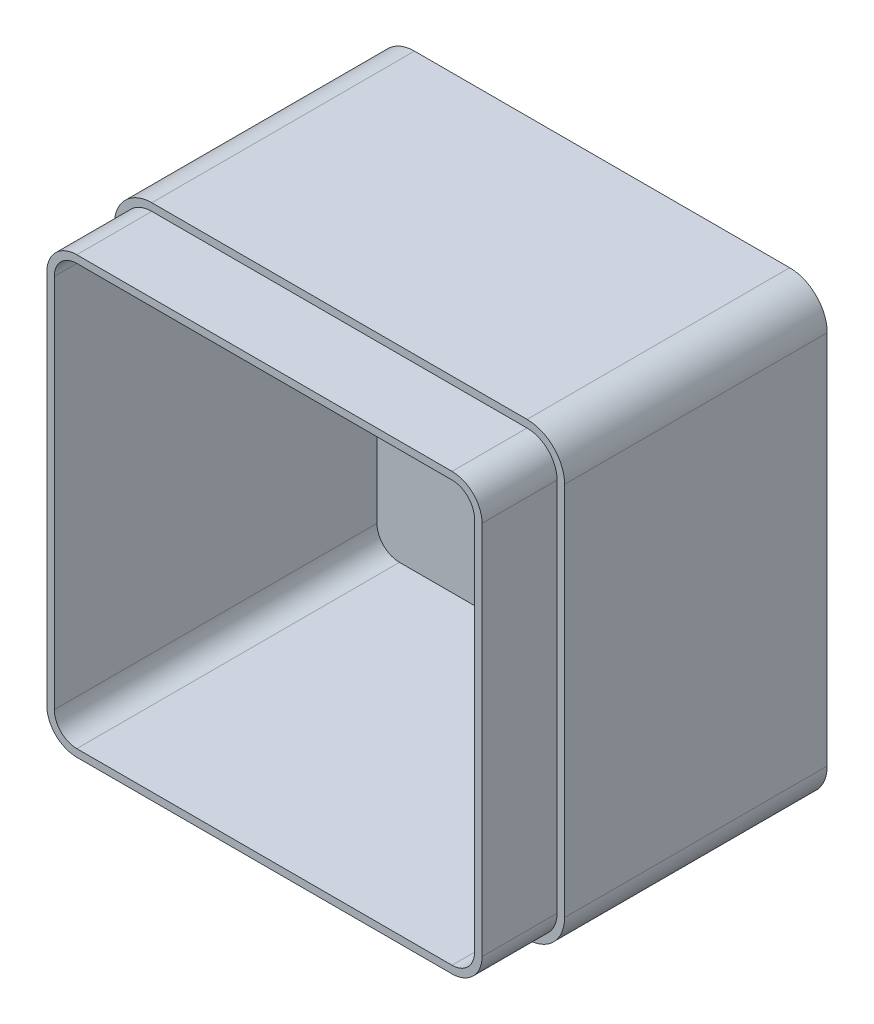
ISO-10303-21;
HEADER;
FILE_DESCRIPTION(('STEP AP214'),'2;1');
FILE_NAME('part.step','',(''),(''),'','','');
FILE_SCHEMA(('AUTOMOTIVE_DESIGN { 1 0 10303 214 1 1 1 1 }'));
ENDSEC;
DATA;
#1=APPLICATION_CONTEXT('core data for automotive mechanical design processes');
#2=APPLICATION_PROTOCOL_DEFINITION('international standard','automotive_design',2000,#1);
#3=PRODUCT_CONTEXT('',#1,'mechanical');
#4=PRODUCT('Part','Part','',(#3));
#5=PRODUCT_RELATED_PRODUCT_CATEGORY('part','',(#4));
#6=PRODUCT_DEFINITION_FORMATION('','',#4);
#7=PRODUCT_DEFINITION_CONTEXT('part definition',#1,'design');
#8=PRODUCT_DEFINITION('design','',#6,#7);
#9=PRODUCT_DEFINITION_SHAPE('','',#8);
#10=(LENGTH_UNIT() NAMED_UNIT(*) SI_UNIT(.MILLI.,.METRE.));
#11=(NAMED_UNIT(*) PLANE_ANGLE_UNIT() SI_UNIT($,.RADIAN.));
#12=(NAMED_UNIT(*) SI_UNIT($,.STERADIAN.) SOLID_ANGLE_UNIT());
#13=UNCERTAINTY_MEASURE_WITH_UNIT(LENGTH_MEASURE(1.E-05),#10,'distance_accuracy_value','');
#14=(GEOMETRIC_REPRESENTATION_CONTEXT(3) GLOBAL_UNCERTAINTY_ASSIGNED_CONTEXT((#13)) GLOBAL_UNIT_ASSIGNED_CONTEXT((#10,
#11,#12)) REPRESENTATION_CONTEXT('',''));
#15=CARTESIAN_POINT('',(0.,0.,0.));
#16=DIRECTION('',(0.,0.,1.));
#17=DIRECTION('',(1.,0.,0.));
#18=AXIS2_PLACEMENT_3D('',#15,#16,#17);
#19=CARTESIAN_POINT('',(0.,0.,90.));
#20=DIRECTION('',(0.,0.,-1.));
#21=DIRECTION('',(-1.,0.,0.));
#22=AXIS2_PLACEMENT_3D('',#19,#20,#21);
#23=PLANE('',#22);
#24=DIRECTION('',(0.,-1.,0.));
#25=VECTOR('',#24,1.);
#26=CARTESIAN_POINT('',(4.,0.,90.));
#27=LINE('',#26,#25);
#28=CARTESIAN_POINT('',(3.99999999999996,110.,90.));
#29=VERTEX_POINT('',#28);
#30=CARTESIAN_POINT('',(4.,10.,90.));
#31=VERTEX_POINT('',#30);
#32=EDGE_CURVE('E303',#29,#31,#27,.T.);
#33=ORIENTED_EDGE('',*,*,#32,.F.);
#34=CARTESIAN_POINT('',(9.99999999999996,110.,90.));
#35=DIRECTION('',(0.,0.,-1.));
#36=DIRECTION('',(-1.,0.,0.));
#37=AXIS2_PLACEMENT_3D('',#34,#35,#36);
#38=CIRCLE('',#37,6.);
#39=CARTESIAN_POINT('',(9.99999999999996,116.,90.));
#40=VERTEX_POINT('',#39);
#41=EDGE_CURVE('E286',#40,#29,#38,.F.);
#42=ORIENTED_EDGE('',*,*,#41,.F.);
#43=DIRECTION('',(-1.,0.,0.));
#44=VECTOR('',#43,1.);
#45=CARTESIAN_POINT('',(0.,116.,90.));
#46=LINE('',#45,#44);
#47=CARTESIAN_POINT('',(110.,116.,90.));
#48=VERTEX_POINT('',#47);
#49=EDGE_CURVE('E312',#48,#40,#46,.T.);
#50=ORIENTED_EDGE('',*,*,#49,.F.);
#51=CARTESIAN_POINT('',(110.,110.,90.));
#52=DIRECTION('',(0.,0.,-1.));
#53=DIRECTION('',(-1.,0.,0.));
#54=AXIS2_PLACEMENT_3D('',#51,#52,#53);
#55=CIRCLE('',#54,6.);
#56=CARTESIAN_POINT('',(116.,110.,90.));
#57=VERTEX_POINT('',#56);
#58=EDGE_CURVE('E335',#57,#48,#55,.F.);
#59=ORIENTED_EDGE('',*,*,#58,.F.);
#60=DIRECTION('',(0.,1.,0.));
#61=VECTOR('',#60,1.);
#62=CARTESIAN_POINT('',(116.,0.,90.));
#63=LINE('',#62,#61);
#64=CARTESIAN_POINT('',(116.,10.,90.));
#65=VERTEX_POINT('',#64);
#66=EDGE_CURVE('E333',#65,#57,#63,.T.);
#67=ORIENTED_EDGE('',*,*,#66,.F.);
#68=CARTESIAN_POINT('',(110.,10.,90.));
#69=DIRECTION('',(0.,0.,-1.));
#70=DIRECTION('',(-1.,0.,0.));
#71=AXIS2_PLACEMENT_3D('',#68,#69,#70);
#72=CIRCLE('',#71,6.);
#73=CARTESIAN_POINT('',(110.,4.,90.));
#74=VERTEX_POINT('',#73);
#75=EDGE_CURVE('E330',#74,#65,#72,.F.);
#76=ORIENTED_EDGE('',*,*,#75,.F.);
#77=DIRECTION('',(1.,0.,0.));
#78=VECTOR('',#77,1.);
#79=CARTESIAN_POINT('',(0.,4.,90.));
#80=LINE('',#79,#78);
#81=CARTESIAN_POINT('',(9.99999999999999,4.,90.));
#82=VERTEX_POINT('',#81);
#83=EDGE_CURVE('E328',#82,#74,#80,.T.);
#84=ORIENTED_EDGE('',*,*,#83,.F.);
#85=CARTESIAN_POINT('',(9.99999999999999,10.,90.));
#86=DIRECTION('',(0.,0.,-1.));
#87=DIRECTION('',(-1.,0.,0.));
#88=AXIS2_PLACEMENT_3D('',#85,#86,#87);
#89=CIRCLE('',#88,6.);
#90=EDGE_CURVE('E319',#31,#82,#89,.F.);
#91=ORIENTED_EDGE('',*,*,#90,.F.);
#92=EDGE_LOOP('',(#33,#42,#50,#59,#67,#76,#84,#91));
#93=FACE_BOUND('',#92,.T.);
#94=CARTESIAN_POINT('',(9.99999999999996,110.,90.));
#95=DIRECTION('',(0.,0.,1.));
#96=DIRECTION('',(1.,0.,0.));
#97=AXIS2_PLACEMENT_3D('',#94,#95,#96);
#98=CIRCLE('',#97,8.);
#99=CARTESIAN_POINT('',(9.99999999999995,118.,90.));
#100=VERTEX_POINT('',#99);
#101=CARTESIAN_POINT('',(1.99999999999996,110.,90.));
#102=VERTEX_POINT('',#101);
#103=EDGE_CURVE('E238',#100,#102,#98,.T.);
#104=ORIENTED_EDGE('',*,*,#103,.T.);
#105=DIRECTION('',(0.,-1.,0.));
#106=VECTOR('',#105,1.);
#107=CARTESIAN_POINT('',(1.99999999999996,110.,90.));
#108=LINE('',#107,#106);
#109=CARTESIAN_POINT('',(2.,9.99999999999999,90.));
#110=VERTEX_POINT('',#109);
#111=EDGE_CURVE('E198',#102,#110,#108,.T.);
#112=ORIENTED_EDGE('',*,*,#111,.T.);
#113=CARTESIAN_POINT('',(9.99999999999999,10.,90.));
#114=DIRECTION('',(0.,0.,1.));
#115=DIRECTION('',(1.,0.,0.));
#116=AXIS2_PLACEMENT_3D('',#113,#114,#115);
#117=CIRCLE('',#116,8.);
#118=CARTESIAN_POINT('',(9.99999999999999,2.,90.));
#119=VERTEX_POINT('',#118);
#120=EDGE_CURVE('E47',#110,#119,#117,.T.);
#121=ORIENTED_EDGE('',*,*,#120,.T.);
#122=DIRECTION('',(1.,0.,0.));
#123=VECTOR('',#122,1.);
#124=CARTESIAN_POINT('',(9.99999999999999,2.,90.));
#125=LINE('',#124,#123);
#126=CARTESIAN_POINT('',(110.,2.,90.));
#127=VERTEX_POINT('',#126);
#128=EDGE_CURVE('E242',#119,#127,#125,.T.);
#129=ORIENTED_EDGE('',*,*,#128,.T.);
#130=CARTESIAN_POINT('',(110.,10.,90.));
#131=DIRECTION('',(0.,0.,1.));
#132=DIRECTION('',(1.,0.,0.));
#133=AXIS2_PLACEMENT_3D('',#130,#131,#132);
#134=CIRCLE('',#133,7.99999999999999);
#135=CARTESIAN_POINT('',(118.,10.,90.));
#136=VERTEX_POINT('',#135);
#137=EDGE_CURVE('E245',#127,#136,#134,.T.);
#138=ORIENTED_EDGE('',*,*,#137,.T.);
#139=DIRECTION('',(0.,1.,0.));
#140=VECTOR('',#139,1.);
#141=CARTESIAN_POINT('',(118.,10.,90.));
#142=LINE('',#141,#140);
#143=CARTESIAN_POINT('',(118.,110.,90.));
#144=VERTEX_POINT('',#143);
#145=EDGE_CURVE('E248',#136,#144,#142,.T.);
#146=ORIENTED_EDGE('',*,*,#145,.T.);
#147=CARTESIAN_POINT('',(110.,110.,90.));
#148=DIRECTION('',(0.,0.,1.));
#149=DIRECTION('',(1.,0.,0.));
#150=AXIS2_PLACEMENT_3D('',#147,#148,#149);
#151=CIRCLE('',#150,7.99999999999999);
#152=CARTESIAN_POINT('',(110.,118.,90.));
#153=VERTEX_POINT('',#152);
#154=EDGE_CURVE('E221',#144,#153,#151,.T.);
#155=ORIENTED_EDGE('',*,*,#154,.T.);
#156=DIRECTION('',(-1.,0.,0.));
#157=VECTOR('',#156,1.);
#158=CARTESIAN_POINT('',(110.,118.,90.));
#159=LINE('',#158,#157);
#160=EDGE_CURVE('E218',#153,#100,#159,.T.);
#161=ORIENTED_EDGE('',*,*,#160,.T.);
#162=EDGE_LOOP('',(#104,#112,#121,#129,#138,#146,#155,#161));
#163=FACE_BOUND('',#162,.T.);
#164=ADVANCED_FACE('F32',(#93,#163),#23,.F.);
#165=CARTESIAN_POINT('',(4.,0.,90.));
#166=DIRECTION('',(1.,0.,0.));
#167=DIRECTION('',(0.,1.,0.));
#168=AXIS2_PLACEMENT_3D('',#165,#166,#167);
#169=PLANE('',#168);
#170=DIRECTION('',(0.,-1.,0.));
#171=VECTOR('',#170,1.);
#172=CARTESIAN_POINT('',(4.,0.,4.));
#173=LINE('',#172,#171);
#174=CARTESIAN_POINT('',(3.99999999999996,110.,4.));
#175=VERTEX_POINT('',#174);
#176=CARTESIAN_POINT('',(4.,10.,4.));
#177=VERTEX_POINT('',#176);
#178=EDGE_CURVE('E280',#175,#177,#173,.T.);
#179=ORIENTED_EDGE('',*,*,#178,.F.);
#180=DIRECTION('',(0.,0.,1.));
#181=VECTOR('',#180,1.);
#182=CARTESIAN_POINT('',(3.99999999999996,110.,90.));
#183=LINE('',#182,#181);
#184=EDGE_CURVE('E287',#29,#175,#183,.F.);
#185=ORIENTED_EDGE('',*,*,#184,.F.);
#186=ORIENTED_EDGE('',*,*,#32,.T.);
#187=DIRECTION('',(0.,0.,1.));
#188=VECTOR('',#187,1.);
#189=CARTESIAN_POINT('',(4.,10.,90.));
#190=LINE('',#189,#188);
#191=EDGE_CURVE('E284',#177,#31,#190,.T.);
#192=ORIENTED_EDGE('',*,*,#191,.F.);
#193=EDGE_LOOP('',(#179,#185,#186,#192));
#194=FACE_BOUND('',#193,.T.);
#195=ADVANCED_FACE('F426',(#194),#169,.T.);
#196=CARTESIAN_POINT('',(0.,4.,90.));
#197=DIRECTION('',(0.,1.,0.));
#198=DIRECTION('',(0.,0.,1.));
#199=AXIS2_PLACEMENT_3D('',#196,#197,#198);
#200=PLANE('',#199);
#201=ORIENTED_EDGE('',*,*,#83,.T.);
#202=DIRECTION('',(0.,0.,1.));
#203=VECTOR('',#202,1.);
#204=CARTESIAN_POINT('',(110.,4.,90.));
#205=LINE('',#204,#203);
#206=CARTESIAN_POINT('',(110.,4.,4.));
#207=VERTEX_POINT('',#206);
#208=EDGE_CURVE('E310',#207,#74,#205,.T.);
#209=ORIENTED_EDGE('',*,*,#208,.F.);
#210=DIRECTION('',(1.,0.,0.));
#211=VECTOR('',#210,1.);
#212=CARTESIAN_POINT('',(0.,4.,4.));
#213=LINE('',#212,#211);
#214=CARTESIAN_POINT('',(9.99999999999999,4.,4.));
#215=VERTEX_POINT('',#214);
#216=EDGE_CURVE('E283',#215,#207,#213,.T.);
#217=ORIENTED_EDGE('',*,*,#216,.F.);
#218=DIRECTION('',(0.,0.,1.));
#219=VECTOR('',#218,1.);
#220=CARTESIAN_POINT('',(9.99999999999999,4.,90.));
#221=LINE('',#220,#219);
#222=EDGE_CURVE('E299',#82,#215,#221,.F.);
#223=ORIENTED_EDGE('',*,*,#222,.F.);
#224=EDGE_LOOP('',(#201,#209,#217,#223));
#225=FACE_BOUND('',#224,.T.);
#226=ADVANCED_FACE('F432',(#225),#200,.T.);
#227=CARTESIAN_POINT('',(116.,0.,90.));
#228=DIRECTION('',(-1.,0.,0.));
#229=DIRECTION('',(0.,-1.,0.));
#230=AXIS2_PLACEMENT_3D('',#227,#228,#229);
#231=PLANE('',#230);
#232=ORIENTED_EDGE('',*,*,#66,.T.);
#233=DIRECTION('',(0.,0.,1.));
#234=VECTOR('',#233,1.);
#235=CARTESIAN_POINT('',(116.,110.,90.));
#236=LINE('',#235,#234);
#237=CARTESIAN_POINT('',(116.,110.,4.));
#238=VERTEX_POINT('',#237);
#239=EDGE_CURVE('E317',#238,#57,#236,.T.);
#240=ORIENTED_EDGE('',*,*,#239,.F.);
#241=DIRECTION('',(0.,1.,0.));
#242=VECTOR('',#241,1.);
#243=CARTESIAN_POINT('',(116.,0.,4.));
#244=LINE('',#243,#242);
#245=CARTESIAN_POINT('',(116.,10.,4.));
#246=VERTEX_POINT('',#245);
#247=EDGE_CURVE('E293',#246,#238,#244,.T.);
#248=ORIENTED_EDGE('',*,*,#247,.F.);
#249=DIRECTION('',(0.,0.,1.));
#250=VECTOR('',#249,1.);
#251=CARTESIAN_POINT('',(116.,10.,90.));
#252=LINE('',#251,#250);
#253=EDGE_CURVE('E313',#65,#246,#252,.F.);
#254=ORIENTED_EDGE('',*,*,#253,.F.);
#255=EDGE_LOOP('',(#232,#240,#248,#254));
#256=FACE_BOUND('',#255,.T.);
#257=ADVANCED_FACE('F461',(#256),#231,.T.);
#258=CARTESIAN_POINT('',(0.,116.,90.));
#259=DIRECTION('',(0.,-1.,0.));
#260=DIRECTION('',(0.,0.,-1.));
#261=AXIS2_PLACEMENT_3D('',#258,#259,#260);
#262=PLANE('',#261);
#263=ORIENTED_EDGE('',*,*,#49,.T.);
#264=DIRECTION('',(0.,0.,-1.));
#265=VECTOR('',#264,1.);
#266=CARTESIAN_POINT('',(9.99999999999996,116.,90.));
#267=LINE('',#266,#265);
#268=CARTESIAN_POINT('',(9.99999999999996,116.,4.));
#269=VERTEX_POINT('',#268);
#270=EDGE_CURVE('E316',#269,#40,#267,.F.);
#271=ORIENTED_EDGE('',*,*,#270,.F.);
#272=DIRECTION('',(-1.,0.,0.));
#273=VECTOR('',#272,1.);
#274=CARTESIAN_POINT('',(0.,116.,4.));
#275=LINE('',#274,#273);
#276=CARTESIAN_POINT('',(110.,116.,4.));
#277=VERTEX_POINT('',#276);
#278=EDGE_CURVE('E300',#277,#269,#275,.T.);
#279=ORIENTED_EDGE('',*,*,#278,.F.);
#280=DIRECTION('',(0.,0.,-1.));
#281=VECTOR('',#280,1.);
#282=CARTESIAN_POINT('',(110.,116.,90.));
#283=LINE('',#282,#281);
#284=EDGE_CURVE('E320',#48,#277,#283,.T.);
#285=ORIENTED_EDGE('',*,*,#284,.F.);
#286=EDGE_LOOP('',(#263,#271,#279,#285));
#287=FACE_BOUND('',#286,.T.);
#288=ADVANCED_FACE('F457',(#287),#262,.T.);
#289=CARTESIAN_POINT('',(0.,0.,4.));
#290=DIRECTION('',(0.,0.,-1.));
#291=DIRECTION('',(-1.,0.,0.));
#292=AXIS2_PLACEMENT_3D('',#289,#290,#291);
#293=PLANE('',#292);
#294=ORIENTED_EDGE('',*,*,#216,.T.);
#295=CARTESIAN_POINT('',(110.,10.,4.));
#296=DIRECTION('',(0.,0.,-1.));
#297=DIRECTION('',(-1.,0.,0.));
#298=AXIS2_PLACEMENT_3D('',#295,#296,#297);
#299=CIRCLE('',#298,6.);
#300=EDGE_CURVE('E295',#246,#207,#299,.T.);
#301=ORIENTED_EDGE('',*,*,#300,.F.);
#302=ORIENTED_EDGE('',*,*,#247,.T.);
#303=CARTESIAN_POINT('',(110.,110.,4.));
#304=DIRECTION('',(0.,0.,-1.));
#305=DIRECTION('',(-1.,0.,0.));
#306=AXIS2_PLACEMENT_3D('',#303,#304,#305);
#307=CIRCLE('',#306,6.);
#308=EDGE_CURVE('E298',#277,#238,#307,.T.);
#309=ORIENTED_EDGE('',*,*,#308,.F.);
#310=ORIENTED_EDGE('',*,*,#278,.T.);
#311=CARTESIAN_POINT('',(9.99999999999996,110.,4.));
#312=DIRECTION('',(0.,0.,-1.));
#313=DIRECTION('',(-1.,0.,0.));
#314=AXIS2_PLACEMENT_3D('',#311,#312,#313);
#315=CIRCLE('',#314,6.);
#316=EDGE_CURVE('E296',#175,#269,#315,.T.);
#317=ORIENTED_EDGE('',*,*,#316,.F.);
#318=ORIENTED_EDGE('',*,*,#178,.T.);
#319=CARTESIAN_POINT('',(9.99999999999999,10.,4.));
#320=DIRECTION('',(0.,0.,-1.));
#321=DIRECTION('',(-1.,0.,0.));
#322=AXIS2_PLACEMENT_3D('',#319,#320,#321);
#323=CIRCLE('',#322,6.);
#324=EDGE_CURVE('E290',#215,#177,#323,.T.);
#325=ORIENTED_EDGE('',*,*,#324,.F.);
#326=EDGE_LOOP('',(#294,#301,#302,#309,#310,#317,#318,#325));
#327=FACE_BOUND('',#326,.T.);
#328=ADVANCED_FACE('F453',(#327),#293,.F.);
#329=CARTESIAN_POINT('',(9.99999999999999,10.,90.));
#330=DIRECTION('',(0.,0.,-1.));
#331=DIRECTION('',(-1.,0.,0.));
#332=AXIS2_PLACEMENT_3D('',#329,#330,#331);
#333=CYLINDRICAL_SURFACE('',#332,6.);
#334=ORIENTED_EDGE('',*,*,#90,.T.);
#335=ORIENTED_EDGE('',*,*,#222,.T.);
#336=ORIENTED_EDGE('',*,*,#324,.T.);
#337=ORIENTED_EDGE('',*,*,#191,.T.);
#338=EDGE_LOOP('',(#334,#335,#336,#337));
#339=FACE_BOUND('',#338,.T.);
#340=ADVANCED_FACE('F449',(#339),#333,.F.);
#341=CARTESIAN_POINT('',(110.,10.,90.));
#342=DIRECTION('',(0.,0.,-1.));
#343=DIRECTION('',(-1.,0.,0.));
#344=AXIS2_PLACEMENT_3D('',#341,#342,#343);
#345=CYLINDRICAL_SURFACE('',#344,6.);
#346=ORIENTED_EDGE('',*,*,#75,.T.);
#347=ORIENTED_EDGE('',*,*,#253,.T.);
#348=ORIENTED_EDGE('',*,*,#300,.T.);
#349=ORIENTED_EDGE('',*,*,#208,.T.);
#350=EDGE_LOOP('',(#346,#347,#348,#349));
#351=FACE_BOUND('',#350,.T.);
#352=ADVANCED_FACE('F445',(#351),#345,.F.);
#353=CARTESIAN_POINT('',(110.,110.,90.));
#354=DIRECTION('',(0.,0.,-1.));
#355=DIRECTION('',(-1.,0.,0.));
#356=AXIS2_PLACEMENT_3D('',#353,#354,#355);
#357=CYLINDRICAL_SURFACE('',#356,6.);
#358=ORIENTED_EDGE('',*,*,#58,.T.);
#359=ORIENTED_EDGE('',*,*,#284,.T.);
#360=ORIENTED_EDGE('',*,*,#308,.T.);
#361=ORIENTED_EDGE('',*,*,#239,.T.);
#362=EDGE_LOOP('',(#358,#359,#360,#361));
#363=FACE_BOUND('',#362,.T.);
#364=ADVANCED_FACE('F441',(#363),#357,.F.);
#365=CARTESIAN_POINT('',(9.99999999999996,110.,90.));
#366=DIRECTION('',(0.,0.,-1.));
#367=DIRECTION('',(-1.,0.,0.));
#368=AXIS2_PLACEMENT_3D('',#365,#366,#367);
#369=CYLINDRICAL_SURFACE('',#368,6.);
#370=ORIENTED_EDGE('',*,*,#41,.T.);
#371=ORIENTED_EDGE('',*,*,#184,.T.);
#372=ORIENTED_EDGE('',*,*,#316,.T.);
#373=ORIENTED_EDGE('',*,*,#270,.T.);
#374=EDGE_LOOP('',(#370,#371,#372,#373));
#375=FACE_BOUND('',#374,.T.);
#376=ADVANCED_FACE('F438',(#375),#369,.F.);
#377=CARTESIAN_POINT('',(9.99999999999996,110.,70.));
#378=DIRECTION('',(0.,0.,1.));
#379=DIRECTION('',(1.,0.,0.));
#380=AXIS2_PLACEMENT_3D('',#377,#378,#379);
#381=PLANE('',#380);
#382=DIRECTION('',(-1.,0.,0.));
#383=VECTOR('',#382,1.);
#384=CARTESIAN_POINT('',(110.,118.,70.));
#385=LINE('',#384,#383);
#386=CARTESIAN_POINT('',(110.,118.,70.));
#387=VERTEX_POINT('',#386);
#388=CARTESIAN_POINT('',(9.99999999999995,118.,70.));
#389=VERTEX_POINT('',#388);
#390=EDGE_CURVE('E204',#387,#389,#385,.T.);
#391=ORIENTED_EDGE('',*,*,#390,.F.);
#392=CARTESIAN_POINT('',(110.,110.,70.));
#393=DIRECTION('',(0.,0.,1.));
#394=DIRECTION('',(1.,0.,0.));
#395=AXIS2_PLACEMENT_3D('',#392,#393,#394);
#396=CIRCLE('',#395,7.99999999999999);
#397=CARTESIAN_POINT('',(118.,110.,70.));
#398=VERTEX_POINT('',#397);
#399=EDGE_CURVE('E234',#398,#387,#396,.T.);
#400=ORIENTED_EDGE('',*,*,#399,.F.);
#401=DIRECTION('',(0.,1.,0.));
#402=VECTOR('',#401,1.);
#403=CARTESIAN_POINT('',(118.,10.,70.));
#404=LINE('',#403,#402);
#405=CARTESIAN_POINT('',(118.,10.,70.));
#406=VERTEX_POINT('',#405);
#407=EDGE_CURVE('E231',#406,#398,#404,.T.);
#408=ORIENTED_EDGE('',*,*,#407,.F.);
#409=CARTESIAN_POINT('',(110.,10.,70.));
#410=DIRECTION('',(0.,0.,1.));
#411=DIRECTION('',(1.,0.,0.));
#412=AXIS2_PLACEMENT_3D('',#409,#410,#411);
#413=CIRCLE('',#412,7.99999999999999);
#414=CARTESIAN_POINT('',(110.,2.,70.));
#415=VERTEX_POINT('',#414);
#416=EDGE_CURVE('E228',#415,#406,#413,.T.);
#417=ORIENTED_EDGE('',*,*,#416,.F.);
#418=DIRECTION('',(1.,0.,0.));
#419=VECTOR('',#418,1.);
#420=CARTESIAN_POINT('',(9.99999999999999,2.,70.));
#421=LINE('',#420,#419);
#422=CARTESIAN_POINT('',(9.99999999999999,2.,70.));
#423=VERTEX_POINT('',#422);
#424=EDGE_CURVE('E225',#423,#415,#421,.T.);
#425=ORIENTED_EDGE('',*,*,#424,.F.);
#426=CARTESIAN_POINT('',(9.99999999999999,10.,70.));
#427=DIRECTION('',(0.,0.,1.));
#428=DIRECTION('',(1.,0.,0.));
#429=AXIS2_PLACEMENT_3D('',#426,#427,#428);
#430=CIRCLE('',#429,8.);
#431=CARTESIAN_POINT('',(2.,9.99999999999999,70.));
#432=VERTEX_POINT('',#431);
#433=EDGE_CURVE('E214',#432,#423,#430,.T.);
#434=ORIENTED_EDGE('',*,*,#433,.F.);
#435=DIRECTION('',(0.,-1.,0.));
#436=VECTOR('',#435,1.);
#437=CARTESIAN_POINT('',(1.99999999999996,110.,70.));
#438=LINE('',#437,#436);
#439=CARTESIAN_POINT('',(1.99999999999996,110.,70.));
#440=VERTEX_POINT('',#439);
#441=EDGE_CURVE('E196',#440,#432,#438,.T.);
#442=ORIENTED_EDGE('',*,*,#441,.F.);
#443=CARTESIAN_POINT('',(9.99999999999996,110.,70.));
#444=DIRECTION('',(0.,0.,1.));
#445=DIRECTION('',(1.,0.,0.));
#446=AXIS2_PLACEMENT_3D('',#443,#444,#445);
#447=CIRCLE('',#446,8.);
#448=EDGE_CURVE('E210',#389,#440,#447,.T.);
#449=ORIENTED_EDGE('',*,*,#448,.F.);
#450=EDGE_LOOP('',(#391,#400,#408,#417,#425,#434,#442,#449));
#451=FACE_BOUND('',#450,.T.);
#452=CARTESIAN_POINT('',(9.99999999999996,110.,70.));
#453=DIRECTION('',(0.,0.,1.));
#454=DIRECTION('',(1.,0.,0.));
#455=AXIS2_PLACEMENT_3D('',#452,#453,#454);
#456=CIRCLE('',#455,10.);
#457=CARTESIAN_POINT('',(9.99999999999996,120.,70.));
#458=VERTEX_POINT('',#457);
#459=CARTESIAN_POINT('',(0.,110.,70.));
#460=VERTEX_POINT('',#459);
#461=EDGE_CURVE('E254',#458,#460,#456,.T.);
#462=ORIENTED_EDGE('',*,*,#461,.T.);
#463=DIRECTION('',(0.,-1.,0.));
#464=VECTOR('',#463,1.);
#465=CARTESIAN_POINT('',(0.,110.,70.));
#466=LINE('',#465,#464);
#467=CARTESIAN_POINT('',(0.,9.99999999999999,70.));
#468=VERTEX_POINT('',#467);
#469=EDGE_CURVE('E267',#460,#468,#466,.T.);
#470=ORIENTED_EDGE('',*,*,#469,.T.);
#471=CARTESIAN_POINT('',(9.99999999999999,10.,70.));
#472=DIRECTION('',(0.,0.,1.));
#473=DIRECTION('',(1.,0.,0.));
#474=AXIS2_PLACEMENT_3D('',#471,#472,#473);
#475=CIRCLE('',#474,10.);
#476=CARTESIAN_POINT('',(9.99999999999999,0.,70.));
#477=VERTEX_POINT('',#476);
#478=EDGE_CURVE('E269',#468,#477,#475,.T.);
#479=ORIENTED_EDGE('',*,*,#478,.T.);
#480=DIRECTION('',(1.,0.,0.));
#481=VECTOR('',#480,1.);
#482=CARTESIAN_POINT('',(9.99999999999999,0.,70.));
#483=LINE('',#482,#481);
#484=CARTESIAN_POINT('',(110.,0.,70.));
#485=VERTEX_POINT('',#484);
#486=EDGE_CURVE('E271',#477,#485,#483,.T.);
#487=ORIENTED_EDGE('',*,*,#486,.T.);
#488=CARTESIAN_POINT('',(110.,10.,70.));
#489=DIRECTION('',(0.,0.,1.));
#490=DIRECTION('',(1.,0.,0.));
#491=AXIS2_PLACEMENT_3D('',#488,#489,#490);
#492=CIRCLE('',#491,9.99999999999999);
#493=CARTESIAN_POINT('',(120.,10.,70.));
#494=VERTEX_POINT('',#493);
#495=EDGE_CURVE('E273',#485,#494,#492,.T.);
#496=ORIENTED_EDGE('',*,*,#495,.T.);
#497=DIRECTION('',(0.,1.,0.));
#498=VECTOR('',#497,1.);
#499=CARTESIAN_POINT('',(120.,10.,70.));
#500=LINE('',#499,#498);
#501=CARTESIAN_POINT('',(120.,110.,70.));
#502=VERTEX_POINT('',#501);
#503=EDGE_CURVE('E275',#494,#502,#500,.T.);
#504=ORIENTED_EDGE('',*,*,#503,.T.);
#505=CARTESIAN_POINT('',(110.,110.,70.));
#506=DIRECTION('',(0.,0.,1.));
#507=DIRECTION('',(1.,0.,0.));
#508=AXIS2_PLACEMENT_3D('',#505,#506,#507);
#509=CIRCLE('',#508,9.99999999999999);
#510=CARTESIAN_POINT('',(110.,120.,70.));
#511=VERTEX_POINT('',#510);
#512=EDGE_CURVE('E277',#502,#511,#509,.T.);
#513=ORIENTED_EDGE('',*,*,#512,.T.);
#514=DIRECTION('',(-1.,0.,0.));
#515=VECTOR('',#514,1.);
#516=CARTESIAN_POINT('',(110.,120.,70.));
#517=LINE('',#516,#515);
#518=EDGE_CURVE('E55',#511,#458,#517,.T.);
#519=ORIENTED_EDGE('',*,*,#518,.T.);
#520=EDGE_LOOP('',(#462,#470,#479,#487,#496,#504,#513,#519));
#521=FACE_BOUND('',#520,.T.);
#522=ADVANCED_FACE('F209',(#451,#521),#381,.T.);
#523=CARTESIAN_POINT('',(9.99999999999996,110.,70.));
#524=DIRECTION('',(0.,0.,1.));
#525=DIRECTION('',(1.,0.,0.));
#526=AXIS2_PLACEMENT_3D('',#523,#524,#525);
#527=CYLINDRICAL_SURFACE('',#526,8.);
#528=ORIENTED_EDGE('',*,*,#103,.F.);
#529=DIRECTION('',(0.,0.,1.));
#530=VECTOR('',#529,1.);
#531=CARTESIAN_POINT('',(9.99999999999995,118.,70.));
#532=LINE('',#531,#530);
#533=EDGE_CURVE('E217',#389,#100,#532,.T.);
#534=ORIENTED_EDGE('',*,*,#533,.F.);
#535=ORIENTED_EDGE('',*,*,#448,.T.);
#536=DIRECTION('',(0.,0.,1.));
#537=VECTOR('',#536,1.);
#538=CARTESIAN_POINT('',(1.99999999999996,110.,70.));
#539=LINE('',#538,#537);
#540=EDGE_CURVE('E193',#440,#102,#539,.T.);
#541=ORIENTED_EDGE('',*,*,#540,.T.);
#542=EDGE_LOOP('',(#528,#534,#535,#541));
#543=FACE_BOUND('',#542,.T.);
#544=ADVANCED_FACE('F216',(#543),#527,.T.);
#545=CARTESIAN_POINT('',(110.,118.,70.));
#546=DIRECTION('',(0.,1.,0.));
#547=DIRECTION('',(0.,0.,1.));
#548=AXIS2_PLACEMENT_3D('',#545,#546,#547);
#549=PLANE('',#548);
#550=ORIENTED_EDGE('',*,*,#160,.F.);
#551=DIRECTION('',(0.,0.,1.));
#552=VECTOR('',#551,1.);
#553=CARTESIAN_POINT('',(110.,118.,70.));
#554=LINE('',#553,#552);
#555=EDGE_CURVE('E255',#387,#153,#554,.T.);
#556=ORIENTED_EDGE('',*,*,#555,.F.);
#557=ORIENTED_EDGE('',*,*,#390,.T.);
#558=ORIENTED_EDGE('',*,*,#533,.T.);
#559=EDGE_LOOP('',(#550,#556,#557,#558));
#560=FACE_BOUND('',#559,.T.);
#561=ADVANCED_FACE('F472',(#560),#549,.T.);
#562=CARTESIAN_POINT('',(110.,110.,70.));
#563=DIRECTION('',(0.,0.,1.));
#564=DIRECTION('',(1.,0.,0.));
#565=AXIS2_PLACEMENT_3D('',#562,#563,#564);
#566=CYLINDRICAL_SURFACE('',#565,7.99999999999999);
#567=ORIENTED_EDGE('',*,*,#154,.F.);
#568=DIRECTION('',(0.,0.,1.));
#569=VECTOR('',#568,1.);
#570=CARTESIAN_POINT('',(118.,110.,70.));
#571=LINE('',#570,#569);
#572=EDGE_CURVE('E257',#398,#144,#571,.T.);
#573=ORIENTED_EDGE('',*,*,#572,.F.);
#574=ORIENTED_EDGE('',*,*,#399,.T.);
#575=ORIENTED_EDGE('',*,*,#555,.T.);
#576=EDGE_LOOP('',(#567,#573,#574,#575));
#577=FACE_BOUND('',#576,.T.);
#578=ADVANCED_FACE('F487',(#577),#566,.T.);
#579=CARTESIAN_POINT('',(118.,10.,70.));
#580=DIRECTION('',(1.,0.,0.));
#581=DIRECTION('',(0.,1.,0.));
#582=AXIS2_PLACEMENT_3D('',#579,#580,#581);
#583=PLANE('',#582);
#584=ORIENTED_EDGE('',*,*,#145,.F.);
#585=DIRECTION('',(0.,0.,1.));
#586=VECTOR('',#585,1.);
#587=CARTESIAN_POINT('',(118.,10.,70.));
#588=LINE('',#587,#586);
#589=EDGE_CURVE('E259',#406,#136,#588,.T.);
#590=ORIENTED_EDGE('',*,*,#589,.F.);
#591=ORIENTED_EDGE('',*,*,#407,.T.);
#592=ORIENTED_EDGE('',*,*,#572,.T.);
#593=EDGE_LOOP('',(#584,#590,#591,#592));
#594=FACE_BOUND('',#593,.T.);
#595=ADVANCED_FACE('F483',(#594),#583,.T.);
#596=CARTESIAN_POINT('',(110.,10.,70.));
#597=DIRECTION('',(0.,0.,1.));
#598=DIRECTION('',(1.,0.,0.));
#599=AXIS2_PLACEMENT_3D('',#596,#597,#598);
#600=CYLINDRICAL_SURFACE('',#599,7.99999999999999);
#601=ORIENTED_EDGE('',*,*,#137,.F.);
#602=DIRECTION('',(0.,0.,1.));
#603=VECTOR('',#602,1.);
#604=CARTESIAN_POINT('',(110.,2.,70.));
#605=LINE('',#604,#603);
#606=EDGE_CURVE('E261',#415,#127,#605,.T.);
#607=ORIENTED_EDGE('',*,*,#606,.F.);
#608=ORIENTED_EDGE('',*,*,#416,.T.);
#609=ORIENTED_EDGE('',*,*,#589,.T.);
#610=EDGE_LOOP('',(#601,#607,#608,#609));
#611=FACE_BOUND('',#610,.T.);
#612=ADVANCED_FACE('F479',(#611),#600,.T.);
#613=CARTESIAN_POINT('',(9.99999999999999,2.,70.));
#614=DIRECTION('',(0.,-1.,0.));
#615=DIRECTION('',(0.,0.,-1.));
#616=AXIS2_PLACEMENT_3D('',#613,#614,#615);
#617=PLANE('',#616);
#618=ORIENTED_EDGE('',*,*,#128,.F.);
#619=DIRECTION('',(0.,0.,1.));
#620=VECTOR('',#619,1.);
#621=CARTESIAN_POINT('',(9.99999999999999,2.,70.));
#622=LINE('',#621,#620);
#623=EDGE_CURVE('E263',#423,#119,#622,.T.);
#624=ORIENTED_EDGE('',*,*,#623,.F.);
#625=ORIENTED_EDGE('',*,*,#424,.T.);
#626=ORIENTED_EDGE('',*,*,#606,.T.);
#627=EDGE_LOOP('',(#618,#624,#625,#626));
#628=FACE_BOUND('',#627,.T.);
#629=ADVANCED_FACE('F476',(#628),#617,.T.);
#630=CARTESIAN_POINT('',(9.99999999999999,10.,70.));
#631=DIRECTION('',(0.,0.,1.));
#632=DIRECTION('',(1.,0.,0.));
#633=AXIS2_PLACEMENT_3D('',#630,#631,#632);
#634=CYLINDRICAL_SURFACE('',#633,8.);
#635=ORIENTED_EDGE('',*,*,#120,.F.);
#636=DIRECTION('',(0.,0.,1.));
#637=VECTOR('',#636,1.);
#638=CARTESIAN_POINT('',(2.,9.99999999999999,70.));
#639=LINE('',#638,#637);
#640=EDGE_CURVE('E203',#432,#110,#639,.T.);
#641=ORIENTED_EDGE('',*,*,#640,.F.);
#642=ORIENTED_EDGE('',*,*,#433,.T.);
#643=ORIENTED_EDGE('',*,*,#623,.T.);
#644=EDGE_LOOP('',(#635,#641,#642,#643));
#645=FACE_BOUND('',#644,.T.);
#646=ADVANCED_FACE('F421',(#645),#634,.T.);
#647=CARTESIAN_POINT('',(1.99999999999996,110.,70.));
#648=DIRECTION('',(-1.,0.,0.));
#649=DIRECTION('',(0.,-1.,0.));
#650=AXIS2_PLACEMENT_3D('',#647,#648,#649);
#651=PLANE('',#650);
#652=ORIENTED_EDGE('',*,*,#111,.F.);
#653=ORIENTED_EDGE('',*,*,#540,.F.);
#654=ORIENTED_EDGE('',*,*,#441,.T.);
#655=ORIENTED_EDGE('',*,*,#640,.T.);
#656=EDGE_LOOP('',(#652,#653,#654,#655));
#657=FACE_BOUND('',#656,.T.);
#658=ADVANCED_FACE('F195',(#657),#651,.T.);
#659=CARTESIAN_POINT('',(0.,0.,0.));
#660=DIRECTION('',(0.,0.,-1.));
#661=DIRECTION('',(-1.,0.,0.));
#662=AXIS2_PLACEMENT_3D('',#659,#660,#661);
#663=PLANE('',#662);
#664=DIRECTION('',(1.,0.,0.));
#665=VECTOR('',#664,1.);
#666=CARTESIAN_POINT('',(0.,0.,0.));
#667=LINE('',#666,#665);
#668=CARTESIAN_POINT('',(9.99999999999999,0.,0.));
#669=VERTEX_POINT('',#668);
#670=CARTESIAN_POINT('',(110.,0.,0.));
#671=VERTEX_POINT('',#670);
#672=EDGE_CURVE('E343',#669,#671,#667,.T.);
#673=ORIENTED_EDGE('',*,*,#672,.F.);
#674=CARTESIAN_POINT('',(9.99999999999999,10.,0.));
#675=DIRECTION('',(0.,0.,-1.));
#676=DIRECTION('',(-1.,0.,0.));
#677=AXIS2_PLACEMENT_3D('',#674,#675,#676);
#678=CIRCLE('',#677,10.);
#679=CARTESIAN_POINT('',(0.,9.99999999999999,0.));
#680=VERTEX_POINT('',#679);
#681=EDGE_CURVE('E363',#669,#680,#678,.T.);
#682=ORIENTED_EDGE('',*,*,#681,.T.);
#683=DIRECTION('',(0.,-1.,0.));
#684=VECTOR('',#683,1.);
#685=CARTESIAN_POINT('',(0.,0.,0.));
#686=LINE('',#685,#684);
#687=CARTESIAN_POINT('',(0.,110.,0.));
#688=VERTEX_POINT('',#687);
#689=EDGE_CURVE('E323',#688,#680,#686,.T.);
#690=ORIENTED_EDGE('',*,*,#689,.F.);
#691=CARTESIAN_POINT('',(9.99999999999996,110.,0.));
#692=DIRECTION('',(0.,0.,-1.));
#693=DIRECTION('',(-1.,0.,0.));
#694=AXIS2_PLACEMENT_3D('',#691,#692,#693);
#695=CIRCLE('',#694,10.);
#696=CARTESIAN_POINT('',(9.99999999999996,120.,0.));
#697=VERTEX_POINT('',#696);
#698=EDGE_CURVE('E357',#688,#697,#695,.T.);
#699=ORIENTED_EDGE('',*,*,#698,.T.);
#700=DIRECTION('',(-1.,0.,0.));
#701=VECTOR('',#700,1.);
#702=CARTESIAN_POINT('',(0.,120.,0.));
#703=LINE('',#702,#701);
#704=CARTESIAN_POINT('',(110.,120.,0.));
#705=VERTEX_POINT('',#704);
#706=EDGE_CURVE('E349',#705,#697,#703,.T.);
#707=ORIENTED_EDGE('',*,*,#706,.F.);
#708=CARTESIAN_POINT('',(110.,110.,0.));
#709=DIRECTION('',(0.,0.,-1.));
#710=DIRECTION('',(-1.,0.,0.));
#711=AXIS2_PLACEMENT_3D('',#708,#709,#710);
#712=CIRCLE('',#711,10.);
#713=CARTESIAN_POINT('',(120.,110.,0.));
#714=VERTEX_POINT('',#713);
#715=EDGE_CURVE('E359',#705,#714,#712,.T.);
#716=ORIENTED_EDGE('',*,*,#715,.T.);
#717=DIRECTION('',(0.,1.,0.));
#718=VECTOR('',#717,1.);
#719=CARTESIAN_POINT('',(120.,0.,0.));
#720=LINE('',#719,#718);
#721=CARTESIAN_POINT('',(120.,10.,0.));
#722=VERTEX_POINT('',#721);
#723=EDGE_CURVE('E346',#722,#714,#720,.T.);
#724=ORIENTED_EDGE('',*,*,#723,.F.);
#725=CARTESIAN_POINT('',(110.,10.,0.));
#726=DIRECTION('',(0.,0.,-1.));
#727=DIRECTION('',(-1.,0.,0.));
#728=AXIS2_PLACEMENT_3D('',#725,#726,#727);
#729=CIRCLE('',#728,10.);
#730=EDGE_CURVE('E361',#722,#671,#729,.T.);
#731=ORIENTED_EDGE('',*,*,#730,.T.);
#732=EDGE_LOOP('',(#673,#682,#690,#699,#707,#716,#724,#731));
#733=FACE_BOUND('',#732,.T.);
#734=ADVANCED_FACE('F413',(#733),#663,.T.);
#735=CARTESIAN_POINT('',(9.99999999999996,110.,90.));
#736=DIRECTION('',(0.,0.,-1.));
#737=DIRECTION('',(-1.,0.,0.));
#738=AXIS2_PLACEMENT_3D('',#735,#736,#737);
#739=CYLINDRICAL_SURFACE('',#738,10.);
#740=DIRECTION('',(0.,0.,-1.));
#741=VECTOR('',#740,1.);
#742=CARTESIAN_POINT('',(0.,110.,90.));
#743=LINE('',#742,#741);
#744=EDGE_CURVE('E365',#460,#688,#743,.T.);
#745=ORIENTED_EDGE('',*,*,#744,.F.);
#746=ORIENTED_EDGE('',*,*,#461,.F.);
#747=DIRECTION('',(0.,0.,-1.));
#748=VECTOR('',#747,1.);
#749=CARTESIAN_POINT('',(9.99999999999996,120.,90.));
#750=LINE('',#749,#748);
#751=EDGE_CURVE('E40',#697,#458,#750,.F.);
#752=ORIENTED_EDGE('',*,*,#751,.F.);
#753=ORIENTED_EDGE('',*,*,#698,.F.);
#754=EDGE_LOOP('',(#745,#746,#752,#753));
#755=FACE_BOUND('',#754,.T.);
#756=ADVANCED_FACE('F34',(#755),#739,.T.);
#757=CARTESIAN_POINT('',(110.,110.,90.));
#758=DIRECTION('',(0.,0.,-1.));
#759=DIRECTION('',(-1.,0.,0.));
#760=AXIS2_PLACEMENT_3D('',#757,#758,#759);
#761=CYLINDRICAL_SURFACE('',#760,10.);
#762=DIRECTION('',(0.,0.,-1.));
#763=VECTOR('',#762,1.);
#764=CARTESIAN_POINT('',(110.,120.,90.));
#765=LINE('',#764,#763);
#766=EDGE_CURVE('E11',#511,#705,#765,.T.);
#767=ORIENTED_EDGE('',*,*,#766,.F.);
#768=ORIENTED_EDGE('',*,*,#512,.F.);
#769=DIRECTION('',(0.,0.,-1.));
#770=VECTOR('',#769,1.);
#771=CARTESIAN_POINT('',(120.,110.,90.));
#772=LINE('',#771,#770);
#773=EDGE_CURVE('E370',#714,#502,#772,.F.);
#774=ORIENTED_EDGE('',*,*,#773,.F.);
#775=ORIENTED_EDGE('',*,*,#715,.F.);
#776=EDGE_LOOP('',(#767,#768,#774,#775));
#777=FACE_BOUND('',#776,.T.);
#778=ADVANCED_FACE('F411',(#777),#761,.T.);
#779=CARTESIAN_POINT('',(0.,120.,90.));
#780=DIRECTION('',(0.,-1.,0.));
#781=DIRECTION('',(0.,0.,-1.));
#782=AXIS2_PLACEMENT_3D('',#779,#780,#781);
#783=PLANE('',#782);
#784=ORIENTED_EDGE('',*,*,#518,.F.);
#785=ORIENTED_EDGE('',*,*,#766,.T.);
#786=ORIENTED_EDGE('',*,*,#706,.T.);
#787=ORIENTED_EDGE('',*,*,#751,.T.);
#788=EDGE_LOOP('',(#784,#785,#786,#787));
#789=FACE_BOUND('',#788,.T.);
#790=ADVANCED_FACE('F377',(#789),#783,.F.);
#791=CARTESIAN_POINT('',(110.,10.,90.));
#792=DIRECTION('',(0.,0.,-1.));
#793=DIRECTION('',(-1.,0.,0.));
#794=AXIS2_PLACEMENT_3D('',#791,#792,#793);
#795=CYLINDRICAL_SURFACE('',#794,10.);
#796=DIRECTION('',(0.,0.,-1.));
#797=VECTOR('',#796,1.);
#798=CARTESIAN_POINT('',(120.,10.,90.));
#799=LINE('',#798,#797);
#800=EDGE_CURVE('E373',#494,#722,#799,.T.);
#801=ORIENTED_EDGE('',*,*,#800,.F.);
#802=ORIENTED_EDGE('',*,*,#495,.F.);
#803=DIRECTION('',(0.,0.,-1.));
#804=VECTOR('',#803,1.);
#805=CARTESIAN_POINT('',(110.,0.,90.));
#806=LINE('',#805,#804);
#807=EDGE_CURVE('E352',#671,#485,#806,.F.);
#808=ORIENTED_EDGE('',*,*,#807,.F.);
#809=ORIENTED_EDGE('',*,*,#730,.F.);
#810=EDGE_LOOP('',(#801,#802,#808,#809));
#811=FACE_BOUND('',#810,.T.);
#812=ADVANCED_FACE('F402',(#811),#795,.T.);
#813=CARTESIAN_POINT('',(120.,0.,90.));
#814=DIRECTION('',(-1.,0.,0.));
#815=DIRECTION('',(0.,-1.,0.));
#816=AXIS2_PLACEMENT_3D('',#813,#814,#815);
#817=PLANE('',#816);
#818=ORIENTED_EDGE('',*,*,#503,.F.);
#819=ORIENTED_EDGE('',*,*,#800,.T.);
#820=ORIENTED_EDGE('',*,*,#723,.T.);
#821=ORIENTED_EDGE('',*,*,#773,.T.);
#822=EDGE_LOOP('',(#818,#819,#820,#821));
#823=FACE_BOUND('',#822,.T.);
#824=ADVANCED_FACE('F407',(#823),#817,.F.);
#825=CARTESIAN_POINT('',(9.99999999999999,10.,90.));
#826=DIRECTION('',(0.,0.,-1.));
#827=DIRECTION('',(-1.,0.,0.));
#828=AXIS2_PLACEMENT_3D('',#825,#826,#827);
#829=CYLINDRICAL_SURFACE('',#828,10.);
#830=DIRECTION('',(0.,0.,-1.));
#831=VECTOR('',#830,1.);
#832=CARTESIAN_POINT('',(9.99999999999999,0.,90.));
#833=LINE('',#832,#831);
#834=EDGE_CURVE('E355',#477,#669,#833,.T.);
#835=ORIENTED_EDGE('',*,*,#834,.F.);
#836=ORIENTED_EDGE('',*,*,#478,.F.);
#837=DIRECTION('',(0.,0.,-1.));
#838=VECTOR('',#837,1.);
#839=CARTESIAN_POINT('',(0.,9.99999999999999,90.));
#840=LINE('',#839,#838);
#841=EDGE_CURVE('E367',#680,#468,#840,.F.);
#842=ORIENTED_EDGE('',*,*,#841,.F.);
#843=ORIENTED_EDGE('',*,*,#681,.F.);
#844=EDGE_LOOP('',(#835,#836,#842,#843));
#845=FACE_BOUND('',#844,.T.);
#846=ADVANCED_FACE('F392',(#845),#829,.T.);
#847=CARTESIAN_POINT('',(0.,0.,90.));
#848=DIRECTION('',(0.,1.,0.));
#849=DIRECTION('',(0.,0.,1.));
#850=AXIS2_PLACEMENT_3D('',#847,#848,#849);
#851=PLANE('',#850);
#852=ORIENTED_EDGE('',*,*,#486,.F.);
#853=ORIENTED_EDGE('',*,*,#834,.T.);
#854=ORIENTED_EDGE('',*,*,#672,.T.);
#855=ORIENTED_EDGE('',*,*,#807,.T.);
#856=EDGE_LOOP('',(#852,#853,#854,#855));
#857=FACE_BOUND('',#856,.T.);
#858=ADVANCED_FACE('F397',(#857),#851,.F.);
#859=CARTESIAN_POINT('',(0.,0.,90.));
#860=DIRECTION('',(1.,0.,0.));
#861=DIRECTION('',(0.,1.,0.));
#862=AXIS2_PLACEMENT_3D('',#859,#860,#861);
#863=PLANE('',#862);
#864=ORIENTED_EDGE('',*,*,#469,.F.);
#865=ORIENTED_EDGE('',*,*,#744,.T.);
#866=ORIENTED_EDGE('',*,*,#689,.T.);
#867=ORIENTED_EDGE('',*,*,#841,.T.);
#868=EDGE_LOOP('',(#864,#865,#866,#867));
#869=FACE_BOUND('',#868,.T.);
#870=ADVANCED_FACE('F387',(#869),#863,.F.);
#871=CLOSED_SHELL('',(#164,#195,#226,#257,#288,#328,#340,#352,#364,#376,#522,#544,#561,#578,
#595,#612,#629,#646,#658,#734,#756,#778,#790,#812,#824,#846,#858,#870));
#872=MANIFOLD_SOLID_BREP('B2',#871);
#873=ADVANCED_BREP_SHAPE_REPRESENTATION('',(#18,#872),#14);
#874=SHAPE_DEFINITION_REPRESENTATION(#9,#873);
ENDSEC;
END-ISO-10303-21;
